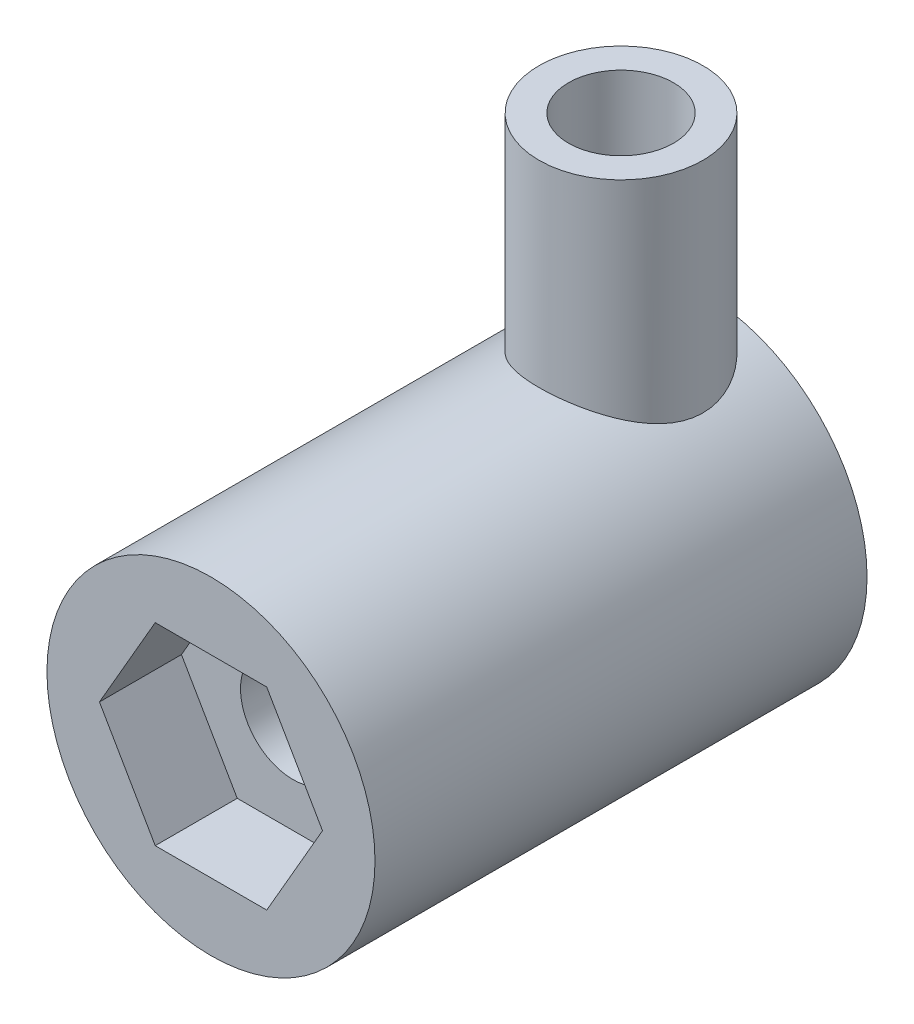
ISO-10303-21;
HEADER;
FILE_DESCRIPTION(('STEP AP214'),'2;1');
FILE_NAME('part.step','',(''),(''),'','','');
FILE_SCHEMA(('AUTOMOTIVE_DESIGN { 1 0 10303 214 1 1 1 1 }'));
ENDSEC;
DATA;
#1=APPLICATION_CONTEXT('core data for automotive mechanical design processes');
#2=APPLICATION_PROTOCOL_DEFINITION('international standard','automotive_design',2000,#1);
#3=PRODUCT_CONTEXT('',#1,'mechanical');
#4=PRODUCT('Part','Part','',(#3));
#5=PRODUCT_RELATED_PRODUCT_CATEGORY('part','',(#4));
#6=PRODUCT_DEFINITION_FORMATION('','',#4);
#7=PRODUCT_DEFINITION_CONTEXT('part definition',#1,'design');
#8=PRODUCT_DEFINITION('design','',#6,#7);
#9=PRODUCT_DEFINITION_SHAPE('','',#8);
#10=(LENGTH_UNIT() NAMED_UNIT(*) SI_UNIT(.MILLI.,.METRE.));
#11=(NAMED_UNIT(*) PLANE_ANGLE_UNIT() SI_UNIT($,.RADIAN.));
#12=(NAMED_UNIT(*) SI_UNIT($,.STERADIAN.) SOLID_ANGLE_UNIT());
#13=UNCERTAINTY_MEASURE_WITH_UNIT(LENGTH_MEASURE(1.E-05),#10,'distance_accuracy_value','');
#14=(GEOMETRIC_REPRESENTATION_CONTEXT(3) GLOBAL_UNCERTAINTY_ASSIGNED_CONTEXT((#13)) GLOBAL_UNIT_ASSIGNED_CONTEXT((#10,
#11,#12)) REPRESENTATION_CONTEXT('',''));
#15=CARTESIAN_POINT('',(0.,0.,0.));
#16=DIRECTION('',(0.,0.,1.));
#17=DIRECTION('',(1.,0.,0.));
#18=AXIS2_PLACEMENT_3D('',#15,#16,#17);
#19=CARTESIAN_POINT('',(0.,0.,15.));
#20=DIRECTION('',(0.,0.,-1.));
#21=DIRECTION('',(-1.,0.,0.));
#22=AXIS2_PLACEMENT_3D('',#19,#20,#21);
#23=CYLINDRICAL_SURFACE('',#22,5.);
#24=CARTESIAN_POINT('',(0.,0.,15.));
#25=DIRECTION('',(0.,0.,1.));
#26=DIRECTION('',(1.,0.,0.));
#27=AXIS2_PLACEMENT_3D('',#24,#25,#26);
#28=CIRCLE('',#27,5.);
#29=CARTESIAN_POINT('',(5.,0.,15.));
#30=VERTEX_POINT('',#29);
#31=EDGE_CURVE('E48',#30,#30,#28,.T.);
#32=ORIENTED_EDGE('',*,*,#31,.F.);
#33=EDGE_LOOP('',(#32));
#34=FACE_BOUND('',#33,.T.);
#35=CARTESIAN_POINT('',(0.,0.,0.));
#36=DIRECTION('',(0.,0.,1.));
#37=DIRECTION('',(1.,0.,0.));
#38=AXIS2_PLACEMENT_3D('',#35,#36,#37);
#39=CIRCLE('',#38,5.);
#40=CARTESIAN_POINT('',(0.,5.,0.));
#41=VERTEX_POINT('',#40);
#42=EDGE_CURVE('E154',#41,#41,#39,.T.);
#43=ORIENTED_EDGE('',*,*,#42,.T.);
#44=CARTESIAN_POINT('',(0.,5.,0.));
#45=CARTESIAN_POINT('',(-0.131426682334305,4.99999177550472,9.66905600811974E-06));
#46=CARTESIAN_POINT('',(-0.263015634437213,4.99476199135277,0.01042556177403));
#47=CARTESIAN_POINT('',(-0.522301454622883,4.9743541856102,0.0516318211620491));
#48=CARTESIAN_POINT('',(-0.649990448564105,4.9591572718767,0.0824608809250183));
#49=CARTESIAN_POINT('',(-0.897333631316203,4.92040690922477,0.16298462271884));
#50=CARTESIAN_POINT('',(-1.01701694536277,4.89688595907259,0.212605987782727));
#51=CARTESIAN_POINT('',(-1.24618160399671,4.84364443325827,0.328926526251794));
#52=CARTESIAN_POINT('',(-1.3556637520377,4.81392434644421,0.395624353145092));
#53=CARTESIAN_POINT('',(-1.56876952630998,4.74890645050632,0.548793131642626));
#54=CARTESIAN_POINT('',(-1.67163802294308,4.71337997659091,0.63621620022978));
#55=CARTESIAN_POINT('',(-1.86194861703333,4.64149925776731,0.82630369598529));
#56=CARTESIAN_POINT('',(-1.94937895911555,4.60514440566897,0.92897962884011));
#57=CARTESIAN_POINT('',(-2.11312999967247,4.53247377945621,1.15620837444528));
#58=CARTESIAN_POINT('',(-2.18806333849064,4.49637967412567,1.28184024603501));
#59=CARTESIAN_POINT('',(-2.31542056761491,4.43214946943555,1.54591833979543));
#60=CARTESIAN_POINT('',(-2.36786053751683,4.40400769020792,1.68435532176262));
#61=CARTESIAN_POINT('',(-2.44533110537653,4.36144667591402,1.96166276359641));
#62=CARTESIAN_POINT('',(-2.47181464267578,4.34630678958452,2.10001113017958));
#63=CARTESIAN_POINT('',(-2.50106748329741,4.3295472487215,2.37994709443761));
#64=CARTESIAN_POINT('',(-2.50386022093906,4.32791423358429,2.52153135217509));
#65=CARTESIAN_POINT('',(-2.48671821792512,4.33777325642936,2.78571506079088));
#66=CARTESIAN_POINT('',(-2.46946139884055,4.34771909154984,2.90856007805829));
#67=CARTESIAN_POINT('',(-2.41734962264384,4.37690571834675,3.14930477343195));
#68=CARTESIAN_POINT('',(-2.38248905974454,4.39614947079454,3.26720286326311));
#69=CARTESIAN_POINT('',(-2.29552445096459,4.44218691031839,3.49807283141433));
#70=CARTESIAN_POINT('',(-2.24303766778988,4.46914601659993,3.61086599696452));
#71=CARTESIAN_POINT('',(-2.12260421917012,4.52758510703513,3.82658573147497));
#72=CARTESIAN_POINT('',(-2.0546506095312,4.55906711950477,3.92950783900021));
#73=CARTESIAN_POINT('',(-1.89516513728194,4.62782894758213,4.13630313185808));
#74=CARTESIAN_POINT('',(-1.8017361459232,4.66533775591865,4.2386421839404));
#75=CARTESIAN_POINT('',(-1.59888894685344,4.73869058251018,4.42683854647725));
#76=CARTESIAN_POINT('',(-1.48946314143572,4.77453379897003,4.51268798008471));
#77=CARTESIAN_POINT('',(-1.25129126457962,4.84254968207409,4.66921415257432));
#78=CARTESIAN_POINT('',(-1.12188397899853,4.87447460405015,4.73900118111436));
#79=CARTESIAN_POINT('',(-0.851165538721986,4.92894702803108,4.85524257260752));
#80=CARTESIAN_POINT('',(-0.709863940663162,4.95150197358893,4.9017154625379));
#81=CARTESIAN_POINT('',(-0.43191622915178,4.98310834353579,4.96618850929171));
#82=CARTESIAN_POINT('',(-0.295853826370906,4.9931234575324,4.986228089367));
#83=CARTESIAN_POINT('',(-0.021948999873288,5.00182533647794,5.00366182783617));
#84=CARTESIAN_POINT('',(0.11589254967511,5.00051746803426,5.0010667140985));
#85=CARTESIAN_POINT('',(0.378082429964657,4.98727980633468,4.9744832789533));
#86=CARTESIAN_POINT('',(0.502648520123707,4.97618114219992,4.9521686681756));
#87=CARTESIAN_POINT('',(0.746017230755973,4.94555428287529,4.88940482026162));
#88=CARTESIAN_POINT('',(0.864819214231884,4.92602515837624,4.84895358386411));
#89=CARTESIAN_POINT('',(1.09722152111965,4.87960628532329,4.75000383391964));
#90=CARTESIAN_POINT('',(1.21057599249831,4.85252204417873,4.69102237471768));
#91=CARTESIAN_POINT('',(1.42615340426439,4.7935993579975,4.55723116087518));
#92=CARTESIAN_POINT('',(1.52837157450204,4.76175888940534,4.48241466348012));
#93=CARTESIAN_POINT('',(1.72941922315487,4.69270553315086,4.31059893670911));
#94=CARTESIAN_POINT('',(1.82693019428496,4.65527212009488,4.2121428290248));
#95=CARTESIAN_POINT('',(2.0046408025722,4.58155978921587,4.00018712195056));
#96=CARTESIAN_POINT('',(2.08482846428685,4.54528168472407,3.88667720293014));
#97=CARTESIAN_POINT('',(2.22926978618995,4.4762798054528,3.64089086451535));
#98=CARTESIAN_POINT('',(2.29256373922243,4.44381323981254,3.50797183470886));
#99=CARTESIAN_POINT('',(2.39520706511459,4.38935180726745,3.23122483111745));
#100=CARTESIAN_POINT('',(2.43458729077056,4.36734345549014,3.08741118400001));
#101=CARTESIAN_POINT('',(2.48465421767005,4.33903752569351,2.80772444263706));
#102=CARTESIAN_POINT('',(2.4977324874436,4.33143458674096,2.67241436588103));
#103=CARTESIAN_POINT('',(2.50172288950898,4.32913386592579,2.40138233261932));
#104=CARTESIAN_POINT('',(2.49264462983266,4.3344304902511,2.26566058012637));
#105=CARTESIAN_POINT('',(2.45481530197332,4.35594655164663,2.01129124438315));
#106=CARTESIAN_POINT('',(2.42802074302696,4.37107736338133,1.89224881827923));
#107=CARTESIAN_POINT('',(2.35793843840544,4.40927540337602,1.66047970780004));
#108=CARTESIAN_POINT('',(2.31464538728732,4.43234518434965,1.54775506843346));
#109=CARTESIAN_POINT('',(2.20953919315538,4.48571326433412,1.32343784728027));
#110=CARTESIAN_POINT('',(2.14667719009403,4.5163930799845,1.21243014826498));
#111=CARTESIAN_POINT('',(2.0053780838799,4.58088327077455,1.00181375675995));
#112=CARTESIAN_POINT('',(1.92693287765888,4.61469526970767,0.902211037371269));
#113=CARTESIAN_POINT('',(1.74550556946066,4.6865581632701,0.70464463625036));
#114=CARTESIAN_POINT('',(1.6407002246921,4.7246249151498,0.608350635828624));
#115=CARTESIAN_POINT('',(1.41539785420684,4.79694347383545,0.434344150571956));
#116=CARTESIAN_POINT('',(1.29489242426332,4.83119321905446,0.356641681394117));
#117=CARTESIAN_POINT('',(1.03978808878536,4.89245149457782,0.221903020515898));
#118=CARTESIAN_POINT('',(0.905095560782288,4.91940711437488,0.16501683221555));
#119=CARTESIAN_POINT('',(0.696328709257351,4.9517796092335,0.0978161412076019));
#120=CARTESIAN_POINT('',(0.625670413494088,4.96122314081874,0.0784446019981889));
#121=CARTESIAN_POINT('',(0.482623997839258,4.97717127275101,0.0459340516294012));
#122=CARTESIAN_POINT('',(0.410236963092401,4.98367766823159,0.0327912333236508));
#123=CARTESIAN_POINT('',(0.28151868462167,4.9923820076613,0.015262527715366));
#124=CARTESIAN_POINT('',(0.225408499555444,4.99523288466454,0.00954506346867461));
#125=CARTESIAN_POINT('',(0.112875528456288,4.99904367329658,0.0019116705342878));
#126=CARTESIAN_POINT('',(0.0564527338382176,5.00000353273198,-4.15322547597115E-06));
#127=CARTESIAN_POINT('',(0.,5.,0.));
#128=B_SPLINE_CURVE_WITH_KNOTS('',3,(#44,#45,#46,#47,#48,#49,#50,#51,#52,#53,#54,#55,#56,#57,
#58,#59,#60,#61,#62,#63,#64,#65,#66,#67,#68,#69,#70,#71,#72,#73,#74,#75,#76,#77,#78,#79,#80,#81,
#82,#83,#84,#85,#86,#87,#88,#89,#90,#91,#92,#93,#94,#95,#96,#97,#98,#99,#100,#101,#102,#103,
#104,#105,#106,#107,#108,#109,#110,#111,#112,#113,#114,#115,#116,#117,#118,#119,#120,#121,#122,
#123,#124,#125,#126,#127),.UNSPECIFIED.,.T.,.F.,(4,2,2,2,2,2,2,2,2,2,2,2,2,2,2,2,2,2,2,2,2,2,2,
2,2,2,2,2,2,2,2,2,2,2,2,2,2,2,2,2,2,4),(0.,0.394060643550731,0.788870374272994,1.18215538873075,
1.57540940145392,1.99245439679522,2.40981559413509,2.85954316076882,3.30894869745703,
3.73145030350574,4.15353393322551,4.52514281023302,4.89687009814197,5.27725600421219,
5.65781303150555,6.08662353334696,6.51563836496716,6.96457555536102,7.41315542280699,
7.82458226178365,8.23581411278691,8.61517266265306,8.99457304077329,9.38482140069747,
9.77523626870849,10.2039902661037,10.6330397153795,11.0828670540368,11.53211279863,
11.9382326875699,12.3441764966107,12.7114482562151,13.0788382197025,13.4709114195009,
13.8631890285845,14.303131068923,14.7433095845248,15.1866003415819,15.407934939208,
15.6291340766843,15.7983933645035,15.9676573239323),.UNSPECIFIED.);
#129=EDGE_CURVE('E11',#41,#41,#128,.T.);
#130=ORIENTED_EDGE('',*,*,#129,.F.);
#131=EDGE_LOOP('',(#43,#130));
#132=FACE_BOUND('',#131,.T.);
#133=ADVANCED_FACE('F35',(#34,#132),#23,.T.);
#134=CARTESIAN_POINT('',(0.,0.,15.));
#135=DIRECTION('',(0.,0.,-1.));
#136=DIRECTION('',(-1.,0.,0.));
#137=AXIS2_PLACEMENT_3D('',#134,#135,#136);
#138=CYLINDRICAL_SURFACE('',#137,1.6);
#139=CARTESIAN_POINT('',(0.,0.,0.));
#140=DIRECTION('',(0.,0.,1.));
#141=DIRECTION('',(1.,0.,0.));
#142=AXIS2_PLACEMENT_3D('',#139,#140,#141);
#143=CIRCLE('',#142,1.6);
#144=CARTESIAN_POINT('',(1.6,0.,0.));
#145=VERTEX_POINT('',#144);
#146=EDGE_CURVE('E151',#145,#145,#143,.T.);
#147=ORIENTED_EDGE('',*,*,#146,.F.);
#148=EDGE_LOOP('',(#147));
#149=FACE_BOUND('',#148,.T.);
#150=CARTESIAN_POINT('',(0.,0.,12.5));
#151=DIRECTION('',(0.,0.,1.));
#152=DIRECTION('',(1.,0.,0.));
#153=AXIS2_PLACEMENT_3D('',#150,#151,#152);
#154=CIRCLE('',#153,1.6);
#155=CARTESIAN_POINT('',(1.6,0.,12.5));
#156=VERTEX_POINT('',#155);
#157=EDGE_CURVE('E145',#156,#156,#154,.T.);
#158=ORIENTED_EDGE('',*,*,#157,.T.);
#159=EDGE_LOOP('',(#158));
#160=FACE_BOUND('',#159,.T.);
#161=ADVANCED_FACE('F201',(#149,#160),#138,.F.);
#162=CARTESIAN_POINT('',(0.,0.,15.));
#163=DIRECTION('',(0.,0.,1.));
#164=DIRECTION('',(1.,0.,0.));
#165=AXIS2_PLACEMENT_3D('',#162,#163,#164);
#166=PLANE('',#165);
#167=DIRECTION('',(0.5,0.866025403784439,0.));
#168=VECTOR('',#167,1.);
#169=CARTESIAN_POINT('',(1.7,-2.94448637286709,15.));
#170=LINE('',#169,#168);
#171=CARTESIAN_POINT('',(1.7,-2.94448637286709,15.));
#172=VERTEX_POINT('',#171);
#173=CARTESIAN_POINT('',(3.4,0.,15.));
#174=VERTEX_POINT('',#173);
#175=EDGE_CURVE('E55',#172,#174,#170,.T.);
#176=ORIENTED_EDGE('',*,*,#175,.F.);
#177=DIRECTION('',(1.,0.,0.));
#178=VECTOR('',#177,1.);
#179=CARTESIAN_POINT('',(-1.7,-2.94448637286709,15.));
#180=LINE('',#179,#178);
#181=CARTESIAN_POINT('',(-1.7,-2.94448637286709,15.));
#182=VERTEX_POINT('',#181);
#183=EDGE_CURVE('E141',#182,#172,#180,.T.);
#184=ORIENTED_EDGE('',*,*,#183,.F.);
#185=DIRECTION('',(0.5,-0.866025403784439,0.));
#186=VECTOR('',#185,1.);
#187=CARTESIAN_POINT('',(-3.4,0.,15.));
#188=LINE('',#187,#186);
#189=CARTESIAN_POINT('',(-3.4,0.,15.));
#190=VERTEX_POINT('',#189);
#191=EDGE_CURVE('E139',#190,#182,#188,.T.);
#192=ORIENTED_EDGE('',*,*,#191,.F.);
#193=DIRECTION('',(-0.5,-0.866025403784439,0.));
#194=VECTOR('',#193,1.);
#195=CARTESIAN_POINT('',(-1.7,2.94448637286709,15.));
#196=LINE('',#195,#194);
#197=CARTESIAN_POINT('',(-1.7,2.94448637286709,15.));
#198=VERTEX_POINT('',#197);
#199=EDGE_CURVE('E105',#198,#190,#196,.T.);
#200=ORIENTED_EDGE('',*,*,#199,.F.);
#201=DIRECTION('',(-1.,0.,0.));
#202=VECTOR('',#201,1.);
#203=CARTESIAN_POINT('',(1.7,2.94448637286709,15.));
#204=LINE('',#203,#202);
#205=CARTESIAN_POINT('',(1.7,2.94448637286709,15.));
#206=VERTEX_POINT('',#205);
#207=EDGE_CURVE('E135',#206,#198,#204,.T.);
#208=ORIENTED_EDGE('',*,*,#207,.F.);
#209=DIRECTION('',(-0.5,0.866025403784438,0.));
#210=VECTOR('',#209,1.);
#211=CARTESIAN_POINT('',(3.4,0.,15.));
#212=LINE('',#211,#210);
#213=EDGE_CURVE('E131',#174,#206,#212,.T.);
#214=ORIENTED_EDGE('',*,*,#213,.F.);
#215=EDGE_LOOP('',(#176,#184,#192,#200,#208,#214));
#216=FACE_BOUND('',#215,.T.);
#217=ORIENTED_EDGE('',*,*,#31,.T.);
#218=EDGE_LOOP('',(#217));
#219=FACE_BOUND('',#218,.T.);
#220=ADVANCED_FACE('F204',(#216,#219),#166,.T.);
#221=CARTESIAN_POINT('',(0.,0.,0.));
#222=DIRECTION('',(0.,0.,1.));
#223=DIRECTION('',(1.,0.,0.));
#224=AXIS2_PLACEMENT_3D('',#221,#222,#223);
#225=PLANE('',#224);
#226=ORIENTED_EDGE('',*,*,#42,.F.);
#227=EDGE_LOOP('',(#226));
#228=FACE_BOUND('',#227,.T.);
#229=ORIENTED_EDGE('',*,*,#146,.T.);
#230=EDGE_LOOP('',(#229));
#231=FACE_BOUND('',#230,.T.);
#232=ADVANCED_FACE('F200',(#228,#231),#225,.F.);
#233=CARTESIAN_POINT('',(1.7,-2.94448637286709,12.5));
#234=DIRECTION('',(0.866025403784439,-0.5,0.));
#235=DIRECTION('',(0.5,0.866025403784439,0.));
#236=AXIS2_PLACEMENT_3D('',#233,#234,#235);
#237=PLANE('',#236);
#238=ORIENTED_EDGE('',*,*,#175,.T.);
#239=DIRECTION('',(0.,0.,1.));
#240=VECTOR('',#239,1.);
#241=CARTESIAN_POINT('',(3.4,0.,12.5));
#242=LINE('',#241,#240);
#243=CARTESIAN_POINT('',(3.4,0.,12.5));
#244=VERTEX_POINT('',#243);
#245=EDGE_CURVE('E86',#244,#174,#242,.T.);
#246=ORIENTED_EDGE('',*,*,#245,.F.);
#247=DIRECTION('',(0.5,0.866025403784439,0.));
#248=VECTOR('',#247,1.);
#249=CARTESIAN_POINT('',(1.7,-2.94448637286709,12.5));
#250=LINE('',#249,#248);
#251=CARTESIAN_POINT('',(1.7,-2.94448637286709,12.5));
#252=VERTEX_POINT('',#251);
#253=EDGE_CURVE('E143',#252,#244,#250,.T.);
#254=ORIENTED_EDGE('',*,*,#253,.F.);
#255=DIRECTION('',(0.,0.,1.));
#256=VECTOR('',#255,1.);
#257=CARTESIAN_POINT('',(1.7,-2.94448637286709,12.5));
#258=LINE('',#257,#256);
#259=EDGE_CURVE('E63',#252,#172,#258,.T.);
#260=ORIENTED_EDGE('',*,*,#259,.T.);
#261=EDGE_LOOP('',(#238,#246,#254,#260));
#262=FACE_BOUND('',#261,.T.);
#263=ADVANCED_FACE('F186',(#262),#237,.F.);
#264=CARTESIAN_POINT('',(-1.7,-2.94448637286709,12.5));
#265=DIRECTION('',(0.,-1.,0.));
#266=DIRECTION('',(1.,0.,0.));
#267=AXIS2_PLACEMENT_3D('',#264,#265,#266);
#268=PLANE('',#267);
#269=ORIENTED_EDGE('',*,*,#183,.T.);
#270=ORIENTED_EDGE('',*,*,#259,.F.);
#271=DIRECTION('',(1.,0.,0.));
#272=VECTOR('',#271,1.);
#273=CARTESIAN_POINT('',(-1.7,-2.94448637286709,12.5));
#274=LINE('',#273,#272);
#275=CARTESIAN_POINT('',(-1.7,-2.94448637286709,12.5));
#276=VERTEX_POINT('',#275);
#277=EDGE_CURVE('E117',#276,#252,#274,.T.);
#278=ORIENTED_EDGE('',*,*,#277,.F.);
#279=DIRECTION('',(0.,0.,1.));
#280=VECTOR('',#279,1.);
#281=CARTESIAN_POINT('',(-1.7,-2.94448637286709,12.5));
#282=LINE('',#281,#280);
#283=EDGE_CURVE('E109',#276,#182,#282,.T.);
#284=ORIENTED_EDGE('',*,*,#283,.T.);
#285=EDGE_LOOP('',(#269,#270,#278,#284));
#286=FACE_BOUND('',#285,.T.);
#287=ADVANCED_FACE('F183',(#286),#268,.F.);
#288=CARTESIAN_POINT('',(-3.4,0.,12.5));
#289=DIRECTION('',(-0.866025403784439,-0.5,0.));
#290=DIRECTION('',(0.5,-0.866025403784439,0.));
#291=AXIS2_PLACEMENT_3D('',#288,#289,#290);
#292=PLANE('',#291);
#293=ORIENTED_EDGE('',*,*,#191,.T.);
#294=ORIENTED_EDGE('',*,*,#283,.F.);
#295=DIRECTION('',(0.5,-0.866025403784439,0.));
#296=VECTOR('',#295,1.);
#297=CARTESIAN_POINT('',(-3.4,0.,12.5));
#298=LINE('',#297,#296);
#299=CARTESIAN_POINT('',(-3.4,0.,12.5));
#300=VERTEX_POINT('',#299);
#301=EDGE_CURVE('E113',#300,#276,#298,.T.);
#302=ORIENTED_EDGE('',*,*,#301,.F.);
#303=DIRECTION('',(0.,0.,1.));
#304=VECTOR('',#303,1.);
#305=CARTESIAN_POINT('',(-3.4,0.,12.5));
#306=LINE('',#305,#304);
#307=EDGE_CURVE('E98',#300,#190,#306,.T.);
#308=ORIENTED_EDGE('',*,*,#307,.T.);
#309=EDGE_LOOP('',(#293,#294,#302,#308));
#310=FACE_BOUND('',#309,.T.);
#311=ADVANCED_FACE('F114',(#310),#292,.F.);
#312=CARTESIAN_POINT('',(-1.7,2.94448637286709,12.5));
#313=DIRECTION('',(-0.866025403784439,0.5,0.));
#314=DIRECTION('',(-0.5,-0.866025403784439,0.));
#315=AXIS2_PLACEMENT_3D('',#312,#313,#314);
#316=PLANE('',#315);
#317=ORIENTED_EDGE('',*,*,#199,.T.);
#318=ORIENTED_EDGE('',*,*,#307,.F.);
#319=DIRECTION('',(-0.5,-0.866025403784439,0.));
#320=VECTOR('',#319,1.);
#321=CARTESIAN_POINT('',(-1.7,2.94448637286709,12.5));
#322=LINE('',#321,#320);
#323=CARTESIAN_POINT('',(-1.7,2.94448637286709,12.5));
#324=VERTEX_POINT('',#323);
#325=EDGE_CURVE('E102',#324,#300,#322,.T.);
#326=ORIENTED_EDGE('',*,*,#325,.F.);
#327=DIRECTION('',(0.,0.,1.));
#328=VECTOR('',#327,1.);
#329=CARTESIAN_POINT('',(-1.7,2.94448637286709,12.5));
#330=LINE('',#329,#328);
#331=EDGE_CURVE('E110',#324,#198,#330,.T.);
#332=ORIENTED_EDGE('',*,*,#331,.T.);
#333=EDGE_LOOP('',(#317,#318,#326,#332));
#334=FACE_BOUND('',#333,.T.);
#335=ADVANCED_FACE('F100',(#334),#316,.F.);
#336=CARTESIAN_POINT('',(1.7,2.94448637286709,12.5));
#337=DIRECTION('',(0.,1.,0.));
#338=DIRECTION('',(0.,0.,1.));
#339=AXIS2_PLACEMENT_3D('',#336,#337,#338);
#340=PLANE('',#339);
#341=ORIENTED_EDGE('',*,*,#207,.T.);
#342=ORIENTED_EDGE('',*,*,#331,.F.);
#343=DIRECTION('',(-1.,0.,0.));
#344=VECTOR('',#343,1.);
#345=CARTESIAN_POINT('',(1.7,2.94448637286709,12.5));
#346=LINE('',#345,#344);
#347=CARTESIAN_POINT('',(1.7,2.94448637286709,12.5));
#348=VERTEX_POINT('',#347);
#349=EDGE_CURVE('E123',#348,#324,#346,.T.);
#350=ORIENTED_EDGE('',*,*,#349,.F.);
#351=DIRECTION('',(0.,0.,1.));
#352=VECTOR('',#351,1.);
#353=CARTESIAN_POINT('',(1.7,2.94448637286709,12.5));
#354=LINE('',#353,#352);
#355=EDGE_CURVE('E148',#348,#206,#354,.T.);
#356=ORIENTED_EDGE('',*,*,#355,.T.);
#357=EDGE_LOOP('',(#341,#342,#350,#356));
#358=FACE_BOUND('',#357,.T.);
#359=ADVANCED_FACE('F191',(#358),#340,.F.);
#360=CARTESIAN_POINT('',(3.4,0.,12.5));
#361=DIRECTION('',(0.866025403784438,0.5,0.));
#362=DIRECTION('',(-0.5,0.866025403784438,0.));
#363=AXIS2_PLACEMENT_3D('',#360,#361,#362);
#364=PLANE('',#363);
#365=ORIENTED_EDGE('',*,*,#213,.T.);
#366=ORIENTED_EDGE('',*,*,#355,.F.);
#367=DIRECTION('',(-0.5,0.866025403784438,0.));
#368=VECTOR('',#367,1.);
#369=CARTESIAN_POINT('',(3.4,0.,12.5));
#370=LINE('',#369,#368);
#371=EDGE_CURVE('E125',#244,#348,#370,.T.);
#372=ORIENTED_EDGE('',*,*,#371,.F.);
#373=ORIENTED_EDGE('',*,*,#245,.T.);
#374=EDGE_LOOP('',(#365,#366,#372,#373));
#375=FACE_BOUND('',#374,.T.);
#376=ADVANCED_FACE('F181',(#375),#364,.F.);
#377=CARTESIAN_POINT('',(0.,0.,12.5));
#378=DIRECTION('',(0.,0.,1.));
#379=DIRECTION('',(1.,0.,0.));
#380=AXIS2_PLACEMENT_3D('',#377,#378,#379);
#381=PLANE('',#380);
#382=ORIENTED_EDGE('',*,*,#157,.F.);
#383=EDGE_LOOP('',(#382));
#384=FACE_BOUND('',#383,.T.);
#385=ORIENTED_EDGE('',*,*,#253,.T.);
#386=ORIENTED_EDGE('',*,*,#371,.T.);
#387=ORIENTED_EDGE('',*,*,#349,.T.);
#388=ORIENTED_EDGE('',*,*,#325,.T.);
#389=ORIENTED_EDGE('',*,*,#301,.T.);
#390=ORIENTED_EDGE('',*,*,#277,.T.);
#391=EDGE_LOOP('',(#385,#386,#387,#388,#389,#390));
#392=FACE_BOUND('',#391,.T.);
#393=ADVANCED_FACE('F120',(#384,#392),#381,.T.);
#394=CARTESIAN_POINT('',(0.,11.,2.5));
#395=DIRECTION('',(0.,-1.,0.));
#396=DIRECTION('',(0.,0.,-1.));
#397=AXIS2_PLACEMENT_3D('',#394,#395,#396);
#398=CYLINDRICAL_SURFACE('',#397,2.5);
#399=CARTESIAN_POINT('',(0.,11.,2.5));
#400=DIRECTION('',(0.,1.,0.));
#401=DIRECTION('',(0.,0.,1.));
#402=AXIS2_PLACEMENT_3D('',#399,#400,#401);
#403=CIRCLE('',#402,2.5);
#404=CARTESIAN_POINT('',(0.,11.,5.));
#405=VERTEX_POINT('',#404);
#406=EDGE_CURVE('E165',#405,#405,#403,.T.);
#407=ORIENTED_EDGE('',*,*,#406,.F.);
#408=EDGE_LOOP('',(#407));
#409=FACE_BOUND('',#408,.T.);
#410=ORIENTED_EDGE('',*,*,#129,.T.);
#411=EDGE_LOOP('',(#410));
#412=FACE_BOUND('',#411,.T.);
#413=ADVANCED_FACE('F171',(#409,#412),#398,.T.);
#414=CARTESIAN_POINT('',(0.,11.,2.5));
#415=DIRECTION('',(0.,-1.,0.));
#416=DIRECTION('',(0.,0.,-1.));
#417=AXIS2_PLACEMENT_3D('',#414,#415,#416);
#418=CYLINDRICAL_SURFACE('',#417,1.6);
#419=CARTESIAN_POINT('',(0.,11.,2.5));
#420=DIRECTION('',(0.,1.,0.));
#421=DIRECTION('',(0.,0.,1.));
#422=AXIS2_PLACEMENT_3D('',#419,#420,#421);
#423=CIRCLE('',#422,1.6);
#424=CARTESIAN_POINT('',(0.,11.,4.1));
#425=VERTEX_POINT('',#424);
#426=EDGE_CURVE('E323',#425,#425,#423,.T.);
#427=ORIENTED_EDGE('',*,*,#426,.T.);
#428=EDGE_LOOP('',(#427));
#429=FACE_BOUND('',#428,.T.);
#430=CARTESIAN_POINT('',(0.,5.,0.9));
#431=CARTESIAN_POINT('',(-0.0874958063159797,4.99999978543627,0.900000243650584));
#432=CARTESIAN_POINT('',(-0.174994637059061,4.99768184156355,0.907200595279256));
#433=CARTESIAN_POINT('',(-0.347426901237483,4.98866262172227,0.935731819529261));
#434=CARTESIAN_POINT('',(-0.432359863373708,4.98196054553558,0.957065271817911));
#435=CARTESIAN_POINT('',(-0.597149225791565,4.96490383635409,1.01306492121177));
#436=CARTESIAN_POINT('',(-0.677013473384595,4.95455502045191,1.0477098923706));
#437=CARTESIAN_POINT('',(-0.829798762851158,4.93126901642872,1.12925683008726));
#438=CARTESIAN_POINT('',(-0.902718607024946,4.91833138300386,1.17616090576561));
#439=CARTESIAN_POINT('',(-1.04189475779498,4.89077067933825,1.28248411350403));
#440=CARTESIAN_POINT('',(-1.1078960922464,4.87610957732918,1.34222709895342));
#441=CARTESIAN_POINT('',(-1.22913423693228,4.8469706570307,1.47184306654741));
#442=CARTESIAN_POINT('',(-1.28436891793797,4.83249287552328,1.54171804765487));
#443=CARTESIAN_POINT('',(-1.38391395073831,4.80494810799029,1.69185285451039));
#444=CARTESIAN_POINT('',(-1.42790123109944,4.79192785635417,1.77233628127054));
#445=CARTESIAN_POINT('',(-1.5016091713459,4.76934657798646,1.94004234377011));
#446=CARTESIAN_POINT('',(-1.53133379773326,4.75978458968016,2.02726309798831));
#447=CARTESIAN_POINT('',(-1.57473134311321,4.74560122760597,2.20308260727288));
#448=CARTESIAN_POINT('',(-1.58887896846386,4.74083414932744,2.29155210175203));
#449=CARTESIAN_POINT('',(-1.60220433058851,4.73634831045,2.46972759918446));
#450=CARTESIAN_POINT('',(-1.6013862709372,4.73662813227306,2.55943324785197));
#451=CARTESIAN_POINT('',(-1.58517380736381,4.74207619100075,2.73356558488824));
#452=CARTESIAN_POINT('',(-1.57038842132725,4.7470401743042,2.8180564534447));
#453=CARTESIAN_POINT('',(-1.52765058974139,4.76096457446162,2.98328884442206));
#454=CARTESIAN_POINT('',(-1.49969668269327,4.76992543490025,3.0640299495852));
#455=CARTESIAN_POINT('',(-1.43099645158812,4.7909865416364,3.22089785882574));
#456=CARTESIAN_POINT('',(-1.39006273103723,4.80313229469362,3.29693621995148));
#457=CARTESIAN_POINT('',(-1.29669494334068,4.82917444861168,3.44126204302677));
#458=CARTESIAN_POINT('',(-1.24425776827155,4.8430713221454,3.50954740274354));
#459=CARTESIAN_POINT('',(-1.12640551540387,4.87186372141871,3.63986467286628));
#460=CARTESIAN_POINT('',(-1.06048936249402,4.8867752080818,3.70144077693881));
#461=CARTESIAN_POINT('',(-0.91908143221715,4.91533168114877,3.81277867823365));
#462=CARTESIAN_POINT('',(-0.843588875652696,4.92897656433707,3.86253951314289));
#463=CARTESIAN_POINT('',(-0.684261580712375,4.95361789744584,3.94916344328023));
#464=CARTESIAN_POINT('',(-0.600361279440636,4.96459080547942,3.98591310083643));
#465=CARTESIAN_POINT('',(-0.427135850361131,4.98248161100196,4.04463959666271));
#466=CARTESIAN_POINT('',(-0.337812463131548,4.98940080204637,4.06662114781672));
#467=CARTESIAN_POINT('',(-0.160141789589319,4.99819424239135,4.09440006666522));
#468=CARTESIAN_POINT('',(-0.0719002860170743,5.00026060178154,4.1008140736111));
#469=CARTESIAN_POINT('',(0.104410269588105,4.99968655318444,4.0990207817787));
#470=CARTESIAN_POINT('',(0.192479346087439,4.99704687004206,4.09081573469012));
#471=CARTESIAN_POINT('',(0.363535018203812,4.98748380317497,4.06050988691884));
#472=CARTESIAN_POINT('',(0.446594362478023,4.98067486649266,4.0387800899141));
#473=CARTESIAN_POINT('',(0.607861654600582,4.96357585995348,3.98249820060375));
#474=CARTESIAN_POINT('',(0.686068993794125,4.95328535439546,3.94794450339783));
#475=CARTESIAN_POINT('',(0.837596923870445,4.92995531019905,3.86602898282185));
#476=CARTESIAN_POINT('',(0.910745620500967,4.9168532627009,3.8183674880577));
#477=CARTESIAN_POINT('',(1.04821150300662,4.8893940824048,3.71194612701437));
#478=CARTESIAN_POINT('',(1.11252617555398,4.87503659432078,3.6531831135417));
#479=CARTESIAN_POINT('',(1.23328321488635,4.84592967283237,3.52332584038904));
#480=CARTESIAN_POINT('',(1.2892857947562,4.83118884166735,3.45181973231152));
#481=CARTESIAN_POINT('',(1.38854141992569,4.80360443110145,3.30010532554179));
#482=CARTESIAN_POINT('',(1.43179457025642,4.79076083607138,3.21989709854595));
#483=CARTESIAN_POINT('',(1.50407580301231,4.76856262886575,3.05315642134392));
#484=CARTESIAN_POINT('',(1.53315066307446,4.75919656820051,2.96664586501031));
#485=CARTESIAN_POINT('',(1.57620668246201,4.74511281699328,2.78959279018968));
#486=CARTESIAN_POINT('',(1.59019395006567,4.74039324536734,2.69905191886402));
#487=CARTESIAN_POINT('',(1.60222535311566,4.73633927898768,2.52112403083601));
#488=CARTESIAN_POINT('',(1.60099388446006,4.73676019091382,2.43379098867101));
#489=CARTESIAN_POINT('',(1.5843835514937,4.74234159093745,2.2606429945653));
#490=CARTESIAN_POINT('',(1.56900540861121,4.74750183734632,2.17482796543897));
#491=CARTESIAN_POINT('',(1.52503332416461,4.76180543144416,2.00851657462312));
#492=CARTESIAN_POINT('',(1.49665627942706,4.77088327236763,1.92795680110713));
#493=CARTESIAN_POINT('',(1.42766427484382,4.79197975594362,1.77267823959919));
#494=CARTESIAN_POINT('',(1.38704674114626,4.8039990169992,1.6979606842373));
#495=CARTESIAN_POINT('',(1.29279266707432,4.83023494368376,1.55319037018559));
#496=CARTESIAN_POINT('',(1.23869308431579,4.8445211905268,1.48345173726596));
#497=CARTESIAN_POINT('',(1.11981399792885,4.87337180847353,1.35380825417904));
#498=CARTESIAN_POINT('',(1.05503158166823,4.88793625446695,1.29390609480135));
#499=CARTESIAN_POINT('',(0.913912210298353,4.91631108200117,1.18354171407617));
#500=CARTESIAN_POINT('',(0.837251351760781,4.93007751880385,1.1334810481157));
#501=CARTESIAN_POINT('',(0.676163529926938,4.9547378769786,1.04701981190277));
#502=CARTESIAN_POINT('',(0.591739263208159,4.96563279071293,1.01061452067921));
#503=CARTESIAN_POINT('',(0.423663431644846,4.98268341064065,0.95475222016956));
#504=CARTESIAN_POINT('',(0.340376766487332,4.9891190130145,0.934281549416891));
#505=CARTESIAN_POINT('',(0.17139400107612,4.99777693541394,0.906906857095988));
#506=CARTESIAN_POINT('',(0.0856984512613952,5.00000021015613,0.899999761354531));
#507=CARTESIAN_POINT('',(0.,5.,0.9));
#508=B_SPLINE_CURVE_WITH_KNOTS('',3,(#430,#431,#432,#433,#434,#435,#436,#437,#438,#439,#440,
#441,#442,#443,#444,#445,#446,#447,#448,#449,#450,#451,#452,#453,#454,#455,#456,#457,#458,#459,
#460,#461,#462,#463,#464,#465,#466,#467,#468,#469,#470,#471,#472,#473,#474,#475,#476,#477,#478,
#479,#480,#481,#482,#483,#484,#485,#486,#487,#488,#489,#490,#491,#492,#493,#494,#495,#496,#497,
#498,#499,#500,#501,#502,#503,#504,#505,#506,#507),.UNSPECIFIED.,.T.,.F.,(4,2,2,2,2,2,2,2,2,2,2,
2,2,2,2,2,2,2,2,2,2,2,2,2,2,2,2,2,2,2,2,2,2,2,2,2,2,2,4),(0.,0.262172289866488,
0.524392446348364,0.786196202111712,1.04804502964703,1.31749718151567,1.58700256668426,
1.86354828826627,2.14001705671955,2.40780489999507,2.67551752794224,2.93207089351445,
3.18865273918778,3.44912195934763,3.70966163813009,3.98267284808623,4.25570628624555,
4.53106471334195,4.80633522466348,5.07051010591344,5.33464430132699,5.59183416387789,
5.84905622438333,6.11273355055081,6.37648573964818,6.6512299305306,6.92597185797942,
7.19980110675104,7.47351945288796,7.73426134972847,7.99498995042988,8.25151822881316,
8.50810048600705,8.77513756675922,9.04224757485583,9.3186628553126,9.5949824844973,
9.85182740305347,10.1086141011961),.UNSPECIFIED.);
#509=CARTESIAN_POINT('',(0.,5.,0.9));
#510=VERTEX_POINT('',#509);
#511=EDGE_CURVE('E132',#510,#510,#508,.T.);
#512=ORIENTED_EDGE('',*,*,#511,.F.);
#513=EDGE_LOOP('',(#512));
#514=FACE_BOUND('',#513,.T.);
#515=ADVANCED_FACE('F166',(#429,#514),#418,.F.);
#516=CARTESIAN_POINT('',(0.,11.,2.5));
#517=DIRECTION('',(0.,1.,0.));
#518=DIRECTION('',(0.,0.,1.));
#519=AXIS2_PLACEMENT_3D('',#516,#517,#518);
#520=PLANE('',#519);
#521=ORIENTED_EDGE('',*,*,#406,.T.);
#522=EDGE_LOOP('',(#521));
#523=FACE_BOUND('',#522,.T.);
#524=ORIENTED_EDGE('',*,*,#426,.F.);
#525=EDGE_LOOP('',(#524));
#526=FACE_BOUND('',#525,.T.);
#527=ADVANCED_FACE('F170',(#523,#526),#520,.T.);
#528=ORIENTED_EDGE('',*,*,#511,.T.);
#529=EDGE_LOOP('',(#528));
#530=FACE_BOUND('',#529,.T.);
#531=ADVANCED_FACE('F37',(#530),#23,.T.);
#532=CLOSED_SHELL('',(#133,#161,#220,#232,#263,#287,#311,#335,#359,#376,#393,#413,#515,#527,#531));
#533=MANIFOLD_SOLID_BREP('B2',#532);
#534=ADVANCED_BREP_SHAPE_REPRESENTATION('',(#18,#533),#14);
#535=SHAPE_DEFINITION_REPRESENTATION(#9,#534);
ENDSEC;
END-ISO-10303-21;
